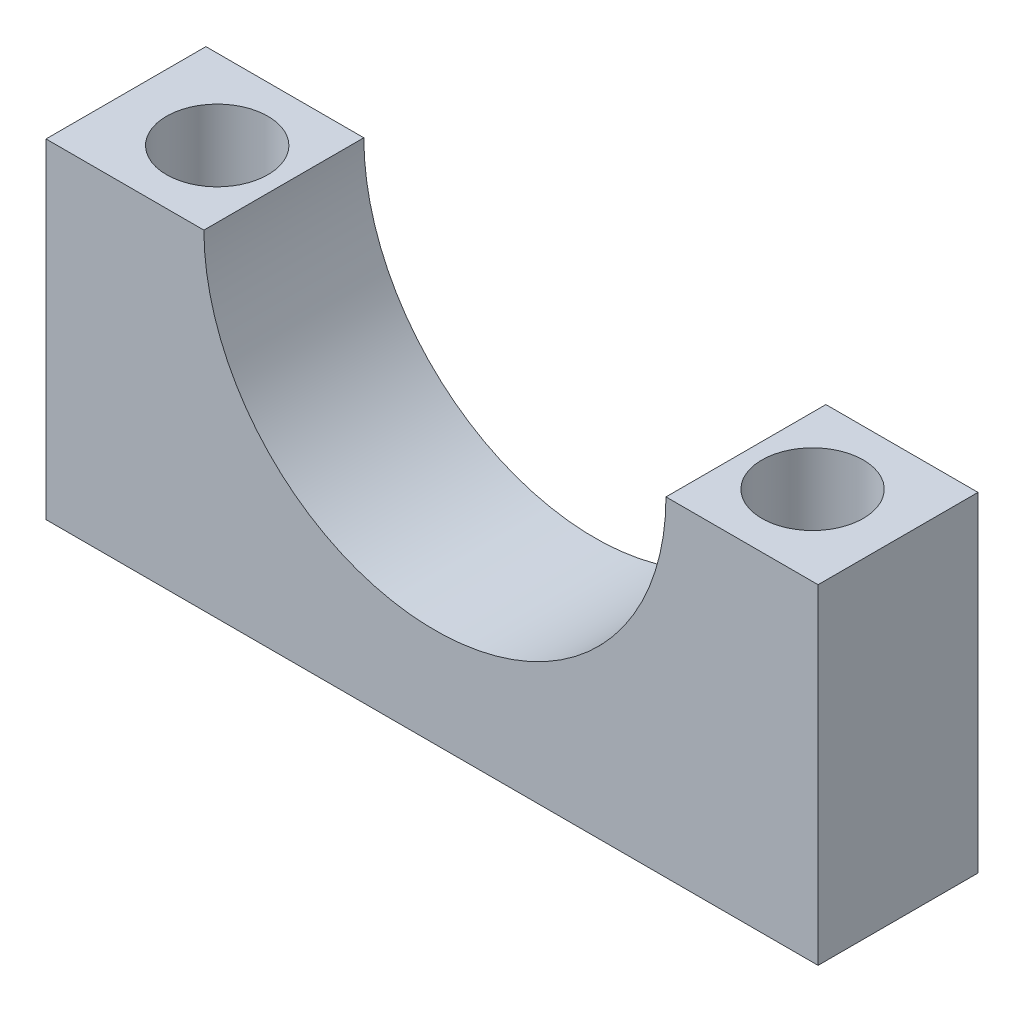
ISO-10303-21;
HEADER;
FILE_DESCRIPTION(('STEP AP214'),'2;1');
FILE_NAME('part.step','',(''),(''),'','','');
FILE_SCHEMA(('AUTOMOTIVE_DESIGN { 1 0 10303 214 1 1 1 1 }'));
ENDSEC;
DATA;
#1=APPLICATION_CONTEXT('core data for automotive mechanical design processes');
#2=APPLICATION_PROTOCOL_DEFINITION('international standard','automotive_design',2000,#1);
#3=PRODUCT_CONTEXT('',#1,'mechanical');
#4=PRODUCT('Part','Part','',(#3));
#5=PRODUCT_RELATED_PRODUCT_CATEGORY('part','',(#4));
#6=PRODUCT_DEFINITION_FORMATION('','',#4);
#7=PRODUCT_DEFINITION_CONTEXT('part definition',#1,'design');
#8=PRODUCT_DEFINITION('design','',#6,#7);
#9=PRODUCT_DEFINITION_SHAPE('','',#8);
#10=(LENGTH_UNIT() NAMED_UNIT(*) SI_UNIT(.MILLI.,.METRE.));
#11=(NAMED_UNIT(*) PLANE_ANGLE_UNIT() SI_UNIT($,.RADIAN.));
#12=(NAMED_UNIT(*) SI_UNIT($,.STERADIAN.) SOLID_ANGLE_UNIT());
#13=UNCERTAINTY_MEASURE_WITH_UNIT(LENGTH_MEASURE(1.E-05),#10,'distance_accuracy_value','');
#14=(GEOMETRIC_REPRESENTATION_CONTEXT(3) GLOBAL_UNCERTAINTY_ASSIGNED_CONTEXT((#13)) GLOBAL_UNIT_ASSIGNED_CONTEXT((#10,
#11,#12)) REPRESENTATION_CONTEXT('',''));
#15=CARTESIAN_POINT('',(0.,0.,0.));
#16=DIRECTION('',(0.,0.,1.));
#17=DIRECTION('',(1.,0.,0.));
#18=AXIS2_PLACEMENT_3D('',#15,#16,#17);
#19=CARTESIAN_POINT('',(0.,0.,5.52));
#20=DIRECTION('',(1.,0.,0.));
#21=DIRECTION('',(0.,0.,-1.));
#22=AXIS2_PLACEMENT_3D('',#19,#20,#21);
#23=PLANE('',#22);
#24=DIRECTION('',(0.,-1.,0.));
#25=VECTOR('',#24,1.);
#26=CARTESIAN_POINT('',(0.,0.,0.));
#27=LINE('',#26,#25);
#28=CARTESIAN_POINT('',(0.,11.38,0.));
#29=VERTEX_POINT('',#28);
#30=CARTESIAN_POINT('',(0.,0.,0.));
#31=VERTEX_POINT('',#30);
#32=EDGE_CURVE('E121',#29,#31,#27,.T.);
#33=ORIENTED_EDGE('',*,*,#32,.T.);
#34=DIRECTION('',(0.,0.,-1.));
#35=VECTOR('',#34,1.);
#36=CARTESIAN_POINT('',(0.,0.,5.52));
#37=LINE('',#36,#35);
#38=CARTESIAN_POINT('',(0.,0.,5.52));
#39=VERTEX_POINT('',#38);
#40=EDGE_CURVE('E11',#39,#31,#37,.T.);
#41=ORIENTED_EDGE('',*,*,#40,.F.);
#42=DIRECTION('',(0.,-1.,0.));
#43=VECTOR('',#42,1.);
#44=CARTESIAN_POINT('',(0.,0.,5.52));
#45=LINE('',#44,#43);
#46=CARTESIAN_POINT('',(0.,11.38,5.52));
#47=VERTEX_POINT('',#46);
#48=EDGE_CURVE('E132',#47,#39,#45,.T.);
#49=ORIENTED_EDGE('',*,*,#48,.F.);
#50=DIRECTION('',(0.,0.,-1.));
#51=VECTOR('',#50,1.);
#52=CARTESIAN_POINT('',(0.,11.38,5.52));
#53=LINE('',#52,#51);
#54=EDGE_CURVE('E117',#47,#29,#53,.T.);
#55=ORIENTED_EDGE('',*,*,#54,.T.);
#56=EDGE_LOOP('',(#33,#41,#49,#55));
#57=FACE_BOUND('',#56,.T.);
#58=ADVANCED_FACE('F37',(#57),#23,.F.);
#59=CARTESIAN_POINT('',(0.,0.,5.52));
#60=DIRECTION('',(0.,1.,0.));
#61=DIRECTION('',(0.,0.,1.));
#62=AXIS2_PLACEMENT_3D('',#59,#60,#61);
#63=PLANE('',#62);
#64=CARTESIAN_POINT('',(3.15,0.,2.76));
#65=DIRECTION('',(0.,1.,0.));
#66=DIRECTION('',(0.,0.,1.));
#67=AXIS2_PLACEMENT_3D('',#64,#65,#66);
#68=CIRCLE('',#67,1.75);
#69=CARTESIAN_POINT('',(3.15,0.,4.51));
#70=VERTEX_POINT('',#69);
#71=EDGE_CURVE('E125',#70,#70,#68,.T.);
#72=ORIENTED_EDGE('',*,*,#71,.T.);
#73=EDGE_LOOP('',(#72));
#74=FACE_BOUND('',#73,.T.);
#75=CARTESIAN_POINT('',(23.7,0.,2.76));
#76=DIRECTION('',(0.,1.,0.));
#77=DIRECTION('',(0.,0.,-1.));
#78=AXIS2_PLACEMENT_3D('',#75,#76,#77);
#79=CIRCLE('',#78,1.75);
#80=CARTESIAN_POINT('',(23.7,0.,1.01));
#81=VERTEX_POINT('',#80);
#82=EDGE_CURVE('E179',#81,#81,#79,.T.);
#83=ORIENTED_EDGE('',*,*,#82,.T.);
#84=EDGE_LOOP('',(#83));
#85=FACE_BOUND('',#84,.T.);
#86=DIRECTION('',(1.,0.,0.));
#87=VECTOR('',#86,1.);
#88=CARTESIAN_POINT('',(0.,0.,0.));
#89=LINE('',#88,#87);
#90=CARTESIAN_POINT('',(26.65,0.,0.));
#91=VERTEX_POINT('',#90);
#92=EDGE_CURVE('E124',#31,#91,#89,.T.);
#93=ORIENTED_EDGE('',*,*,#92,.T.);
#94=DIRECTION('',(0.,0.,-1.));
#95=VECTOR('',#94,1.);
#96=CARTESIAN_POINT('',(26.65,0.,5.52));
#97=LINE('',#96,#95);
#98=CARTESIAN_POINT('',(26.65,0.,5.52));
#99=VERTEX_POINT('',#98);
#100=EDGE_CURVE('E45',#99,#91,#97,.T.);
#101=ORIENTED_EDGE('',*,*,#100,.F.);
#102=DIRECTION('',(1.,0.,0.));
#103=VECTOR('',#102,1.);
#104=CARTESIAN_POINT('',(0.,0.,5.52));
#105=LINE('',#104,#103);
#106=EDGE_CURVE('E90',#39,#99,#105,.T.);
#107=ORIENTED_EDGE('',*,*,#106,.F.);
#108=ORIENTED_EDGE('',*,*,#40,.T.);
#109=EDGE_LOOP('',(#93,#101,#107,#108));
#110=FACE_BOUND('',#109,.T.);
#111=ADVANCED_FACE('F158',(#74,#85,#110),#63,.F.);
#112=CARTESIAN_POINT('',(26.65,0.,5.52));
#113=DIRECTION('',(-1.,0.,0.));
#114=DIRECTION('',(0.,0.,1.));
#115=AXIS2_PLACEMENT_3D('',#112,#113,#114);
#116=PLANE('',#115);
#117=DIRECTION('',(0.,1.,0.));
#118=VECTOR('',#117,1.);
#119=CARTESIAN_POINT('',(26.65,0.,0.));
#120=LINE('',#119,#118);
#121=CARTESIAN_POINT('',(26.65,11.38,0.));
#122=VERTEX_POINT('',#121);
#123=EDGE_CURVE('E127',#91,#122,#120,.T.);
#124=ORIENTED_EDGE('',*,*,#123,.T.);
#125=DIRECTION('',(0.,0.,-1.));
#126=VECTOR('',#125,1.);
#127=CARTESIAN_POINT('',(26.65,11.38,5.52));
#128=LINE('',#127,#126);
#129=CARTESIAN_POINT('',(26.65,11.38,5.52));
#130=VERTEX_POINT('',#129);
#131=EDGE_CURVE('E112',#130,#122,#128,.T.);
#132=ORIENTED_EDGE('',*,*,#131,.F.);
#133=DIRECTION('',(0.,1.,0.));
#134=VECTOR('',#133,1.);
#135=CARTESIAN_POINT('',(26.65,0.,5.52));
#136=LINE('',#135,#134);
#137=EDGE_CURVE('E103',#99,#130,#136,.T.);
#138=ORIENTED_EDGE('',*,*,#137,.F.);
#139=ORIENTED_EDGE('',*,*,#100,.T.);
#140=EDGE_LOOP('',(#124,#132,#138,#139));
#141=FACE_BOUND('',#140,.T.);
#142=ADVANCED_FACE('F138',(#141),#116,.F.);
#143=CARTESIAN_POINT('',(21.4,11.38,5.52));
#144=DIRECTION('',(0.,-1.,0.));
#145=DIRECTION('',(0.,0.,-1.));
#146=AXIS2_PLACEMENT_3D('',#143,#144,#145);
#147=PLANE('',#146);
#148=CARTESIAN_POINT('',(23.7,11.38,2.76));
#149=DIRECTION('',(0.,1.,0.));
#150=DIRECTION('',(0.,0.,-1.));
#151=AXIS2_PLACEMENT_3D('',#148,#149,#150);
#152=CIRCLE('',#151,1.75);
#153=CARTESIAN_POINT('',(23.7,11.38,1.01));
#154=VERTEX_POINT('',#153);
#155=EDGE_CURVE('E176',#154,#154,#152,.T.);
#156=ORIENTED_EDGE('',*,*,#155,.F.);
#157=EDGE_LOOP('',(#156));
#158=FACE_BOUND('',#157,.T.);
#159=DIRECTION('',(-1.,0.,0.));
#160=VECTOR('',#159,1.);
#161=CARTESIAN_POINT('',(21.4,11.38,0.));
#162=LINE('',#161,#160);
#163=CARTESIAN_POINT('',(21.4,11.38,0.));
#164=VERTEX_POINT('',#163);
#165=EDGE_CURVE('E111',#122,#164,#162,.T.);
#166=ORIENTED_EDGE('',*,*,#165,.T.);
#167=DIRECTION('',(0.,0.,-1.));
#168=VECTOR('',#167,1.);
#169=CARTESIAN_POINT('',(21.4,11.38,5.52));
#170=LINE('',#169,#168);
#171=CARTESIAN_POINT('',(21.4,11.38,5.52));
#172=VERTEX_POINT('',#171);
#173=EDGE_CURVE('E108',#172,#164,#170,.T.);
#174=ORIENTED_EDGE('',*,*,#173,.F.);
#175=DIRECTION('',(-1.,0.,0.));
#176=VECTOR('',#175,1.);
#177=CARTESIAN_POINT('',(21.4,11.38,5.52));
#178=LINE('',#177,#176);
#179=EDGE_CURVE('E97',#130,#172,#178,.T.);
#180=ORIENTED_EDGE('',*,*,#179,.F.);
#181=ORIENTED_EDGE('',*,*,#131,.T.);
#182=EDGE_LOOP('',(#166,#174,#180,#181));
#183=FACE_BOUND('',#182,.T.);
#184=ADVANCED_FACE('F109',(#158,#183),#147,.F.);
#185=CARTESIAN_POINT('',(13.425,11.38,5.52));
#186=DIRECTION('',(0.,0.,-1.));
#187=DIRECTION('',(-1.,0.,0.));
#188=AXIS2_PLACEMENT_3D('',#185,#186,#187);
#189=CYLINDRICAL_SURFACE('',#188,7.975);
#190=CARTESIAN_POINT('',(13.425,11.38,0.));
#191=DIRECTION('',(0.,0.,-1.));
#192=DIRECTION('',(1.,0.,0.));
#193=AXIS2_PLACEMENT_3D('',#190,#191,#192);
#194=CIRCLE('',#193,7.975);
#195=CARTESIAN_POINT('',(5.45,11.38,0.));
#196=VERTEX_POINT('',#195);
#197=EDGE_CURVE('E76',#164,#196,#194,.T.);
#198=ORIENTED_EDGE('',*,*,#197,.T.);
#199=DIRECTION('',(0.,0.,-1.));
#200=VECTOR('',#199,1.);
#201=CARTESIAN_POINT('',(5.45,11.38,5.52));
#202=LINE('',#201,#200);
#203=CARTESIAN_POINT('',(5.45,11.38,5.52));
#204=VERTEX_POINT('',#203);
#205=EDGE_CURVE('E113',#204,#196,#202,.T.);
#206=ORIENTED_EDGE('',*,*,#205,.F.);
#207=CARTESIAN_POINT('',(13.425,11.38,5.52));
#208=DIRECTION('',(0.,0.,-1.));
#209=DIRECTION('',(1.,0.,0.));
#210=AXIS2_PLACEMENT_3D('',#207,#208,#209);
#211=CIRCLE('',#210,7.975);
#212=EDGE_CURVE('E101',#172,#204,#211,.T.);
#213=ORIENTED_EDGE('',*,*,#212,.F.);
#214=ORIENTED_EDGE('',*,*,#173,.T.);
#215=EDGE_LOOP('',(#198,#206,#213,#214));
#216=FACE_BOUND('',#215,.T.);
#217=ADVANCED_FACE('F115',(#216),#189,.F.);
#218=CARTESIAN_POINT('',(0.,11.38,5.52));
#219=DIRECTION('',(0.,-1.,0.));
#220=DIRECTION('',(0.,0.,-1.));
#221=AXIS2_PLACEMENT_3D('',#218,#219,#220);
#222=PLANE('',#221);
#223=CARTESIAN_POINT('',(3.15,11.38,2.76));
#224=DIRECTION('',(0.,1.,0.));
#225=DIRECTION('',(0.,0.,1.));
#226=AXIS2_PLACEMENT_3D('',#223,#224,#225);
#227=CIRCLE('',#226,1.75);
#228=CARTESIAN_POINT('',(3.15,11.38,4.51));
#229=VERTEX_POINT('',#228);
#230=EDGE_CURVE('E178',#229,#229,#227,.T.);
#231=ORIENTED_EDGE('',*,*,#230,.F.);
#232=EDGE_LOOP('',(#231));
#233=FACE_BOUND('',#232,.T.);
#234=DIRECTION('',(-1.,0.,0.));
#235=VECTOR('',#234,1.);
#236=CARTESIAN_POINT('',(0.,11.38,0.));
#237=LINE('',#236,#235);
#238=EDGE_CURVE('E82',#196,#29,#237,.T.);
#239=ORIENTED_EDGE('',*,*,#238,.T.);
#240=ORIENTED_EDGE('',*,*,#54,.F.);
#241=DIRECTION('',(-1.,0.,0.));
#242=VECTOR('',#241,1.);
#243=CARTESIAN_POINT('',(0.,11.38,5.52));
#244=LINE('',#243,#242);
#245=EDGE_CURVE('E53',#204,#47,#244,.T.);
#246=ORIENTED_EDGE('',*,*,#245,.F.);
#247=ORIENTED_EDGE('',*,*,#205,.T.);
#248=EDGE_LOOP('',(#239,#240,#246,#247));
#249=FACE_BOUND('',#248,.T.);
#250=ADVANCED_FACE('F145',(#233,#249),#222,.F.);
#251=CARTESIAN_POINT('',(13.425,11.38,5.52));
#252=DIRECTION('',(0.,0.,1.));
#253=DIRECTION('',(1.,0.,0.));
#254=AXIS2_PLACEMENT_3D('',#251,#252,#253);
#255=PLANE('',#254);
#256=ORIENTED_EDGE('',*,*,#48,.T.);
#257=ORIENTED_EDGE('',*,*,#106,.T.);
#258=ORIENTED_EDGE('',*,*,#137,.T.);
#259=ORIENTED_EDGE('',*,*,#179,.T.);
#260=ORIENTED_EDGE('',*,*,#212,.T.);
#261=ORIENTED_EDGE('',*,*,#245,.T.);
#262=EDGE_LOOP('',(#256,#257,#258,#259,#260,#261));
#263=FACE_BOUND('',#262,.T.);
#264=ADVANCED_FACE('F99',(#263),#255,.T.);
#265=CARTESIAN_POINT('',(13.425,11.38,0.));
#266=DIRECTION('',(0.,0.,1.));
#267=DIRECTION('',(1.,0.,0.));
#268=AXIS2_PLACEMENT_3D('',#265,#266,#267);
#269=PLANE('',#268);
#270=ORIENTED_EDGE('',*,*,#32,.F.);
#271=ORIENTED_EDGE('',*,*,#238,.F.);
#272=ORIENTED_EDGE('',*,*,#197,.F.);
#273=ORIENTED_EDGE('',*,*,#165,.F.);
#274=ORIENTED_EDGE('',*,*,#123,.F.);
#275=ORIENTED_EDGE('',*,*,#92,.F.);
#276=EDGE_LOOP('',(#270,#271,#272,#273,#274,#275));
#277=FACE_BOUND('',#276,.T.);
#278=ADVANCED_FACE('F141',(#277),#269,.F.);
#279=CARTESIAN_POINT('',(3.15,0.,2.76));
#280=DIRECTION('',(0.,1.,0.));
#281=DIRECTION('',(0.,0.,1.));
#282=AXIS2_PLACEMENT_3D('',#279,#280,#281);
#283=CYLINDRICAL_SURFACE('',#282,1.75);
#284=ORIENTED_EDGE('',*,*,#71,.F.);
#285=EDGE_LOOP('',(#284));
#286=FACE_BOUND('',#285,.T.);
#287=ORIENTED_EDGE('',*,*,#230,.T.);
#288=EDGE_LOOP('',(#287));
#289=FACE_BOUND('',#288,.T.);
#290=ADVANCED_FACE('F190',(#286,#289),#283,.F.);
#291=CARTESIAN_POINT('',(23.7,0.,2.76));
#292=DIRECTION('',(0.,1.,0.));
#293=DIRECTION('',(0.,0.,1.));
#294=AXIS2_PLACEMENT_3D('',#291,#292,#293);
#295=CYLINDRICAL_SURFACE('',#294,1.75);
#296=ORIENTED_EDGE('',*,*,#82,.F.);
#297=EDGE_LOOP('',(#296));
#298=FACE_BOUND('',#297,.T.);
#299=ORIENTED_EDGE('',*,*,#155,.T.);
#300=EDGE_LOOP('',(#299));
#301=FACE_BOUND('',#300,.T.);
#302=ADVANCED_FACE('F193',(#298,#301),#295,.F.);
#303=CLOSED_SHELL('',(#58,#111,#142,#184,#217,#250,#264,#278,#290,#302));
#304=MANIFOLD_SOLID_BREP('B2',#303);
#305=ADVANCED_BREP_SHAPE_REPRESENTATION('',(#18,#304),#14);
#306=SHAPE_DEFINITION_REPRESENTATION(#9,#305);
ENDSEC;
END-ISO-10303-21;
